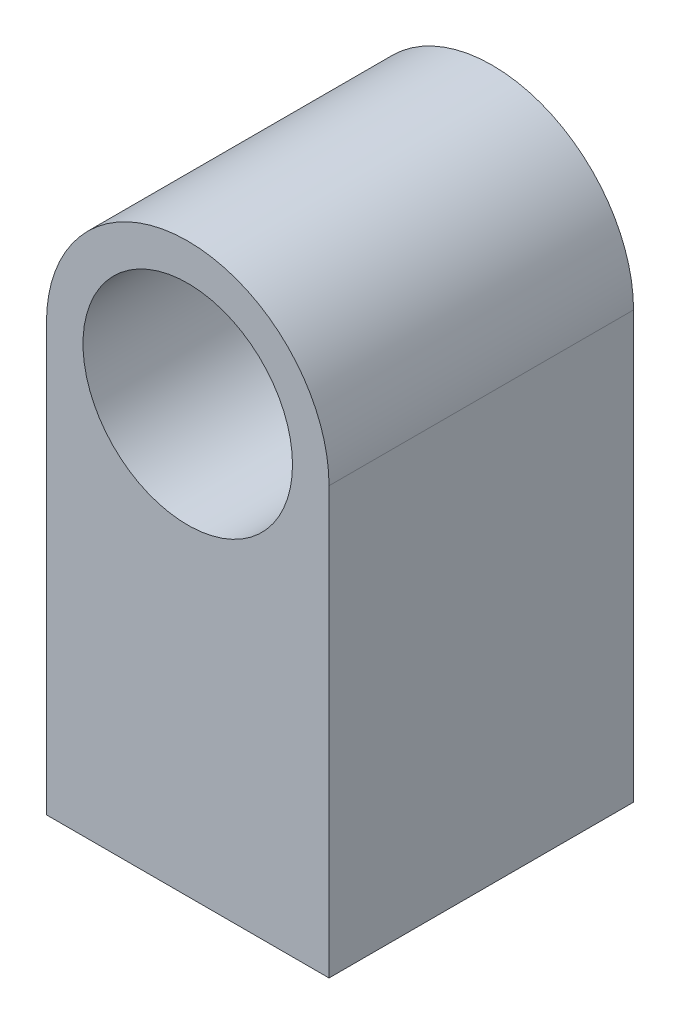
ISO-10303-21;
HEADER;
FILE_DESCRIPTION(('STEP AP214'),'2;1');
FILE_NAME('part.step','',(''),(''),'','','');
FILE_SCHEMA(('AUTOMOTIVE_DESIGN { 1 0 10303 214 1 1 1 1 }'));
ENDSEC;
DATA;
#1=APPLICATION_CONTEXT('core data for automotive mechanical design processes');
#2=APPLICATION_PROTOCOL_DEFINITION('international standard','automotive_design',2000,#1);
#3=PRODUCT_CONTEXT('',#1,'mechanical');
#4=PRODUCT('Part','Part','',(#3));
#5=PRODUCT_RELATED_PRODUCT_CATEGORY('part','',(#4));
#6=PRODUCT_DEFINITION_FORMATION('','',#4);
#7=PRODUCT_DEFINITION_CONTEXT('part definition',#1,'design');
#8=PRODUCT_DEFINITION('design','',#6,#7);
#9=PRODUCT_DEFINITION_SHAPE('','',#8);
#10=(LENGTH_UNIT() NAMED_UNIT(*) SI_UNIT(.MILLI.,.METRE.));
#11=(NAMED_UNIT(*) PLANE_ANGLE_UNIT() SI_UNIT($,.RADIAN.));
#12=(NAMED_UNIT(*) SI_UNIT($,.STERADIAN.) SOLID_ANGLE_UNIT());
#13=UNCERTAINTY_MEASURE_WITH_UNIT(LENGTH_MEASURE(1.E-05),#10,'distance_accuracy_value','');
#14=(GEOMETRIC_REPRESENTATION_CONTEXT(3) GLOBAL_UNCERTAINTY_ASSIGNED_CONTEXT((#13)) GLOBAL_UNIT_ASSIGNED_CONTEXT((#10,
#11,#12)) REPRESENTATION_CONTEXT('',''));
#15=CARTESIAN_POINT('',(0.,0.,0.));
#16=DIRECTION('',(0.,0.,1.));
#17=DIRECTION('',(1.,0.,0.));
#18=AXIS2_PLACEMENT_3D('',#15,#16,#17);
#19=CARTESIAN_POINT('',(11.6,-10.,-12.5));
#20=DIRECTION('',(1.,0.,0.));
#21=DIRECTION('',(0.,1.,0.));
#22=AXIS2_PLACEMENT_3D('',#19,#20,#21);
#23=PLANE('',#22);
#24=DIRECTION('',(0.,1.,0.));
#25=VECTOR('',#24,1.);
#26=CARTESIAN_POINT('',(11.6,-10.,12.5));
#27=LINE('',#26,#25);
#28=CARTESIAN_POINT('',(11.6,-35.,12.5));
#29=VERTEX_POINT('',#28);
#30=CARTESIAN_POINT('',(11.6,0.,12.5));
#31=VERTEX_POINT('',#30);
#32=EDGE_CURVE('E122',#29,#31,#27,.T.);
#33=ORIENTED_EDGE('',*,*,#32,.F.);
#34=DIRECTION('',(0.,0.,1.));
#35=VECTOR('',#34,1.);
#36=CARTESIAN_POINT('',(11.6,-35.,-12.5));
#37=LINE('',#36,#35);
#38=CARTESIAN_POINT('',(11.6,-35.,-12.5));
#39=VERTEX_POINT('',#38);
#40=EDGE_CURVE('E101',#39,#29,#37,.T.);
#41=ORIENTED_EDGE('',*,*,#40,.F.);
#42=DIRECTION('',(0.,1.,0.));
#43=VECTOR('',#42,1.);
#44=CARTESIAN_POINT('',(11.6,-10.,-12.5));
#45=LINE('',#44,#43);
#46=CARTESIAN_POINT('',(11.6,0.,-12.5));
#47=VERTEX_POINT('',#46);
#48=EDGE_CURVE('E96',#39,#47,#45,.T.);
#49=ORIENTED_EDGE('',*,*,#48,.T.);
#50=DIRECTION('',(0.,0.,1.));
#51=VECTOR('',#50,1.);
#52=CARTESIAN_POINT('',(11.6,0.,-12.5));
#53=LINE('',#52,#51);
#54=EDGE_CURVE('E66',#47,#31,#53,.T.);
#55=ORIENTED_EDGE('',*,*,#54,.T.);
#56=EDGE_LOOP('',(#33,#41,#49,#55));
#57=FACE_BOUND('',#56,.T.);
#58=ADVANCED_FACE('F39',(#57),#23,.T.);
#59=CARTESIAN_POINT('',(-11.6,-10.,-12.5));
#60=DIRECTION('',(-1.,0.,0.));
#61=DIRECTION('',(0.,-1.,0.));
#62=AXIS2_PLACEMENT_3D('',#59,#60,#61);
#63=PLANE('',#62);
#64=DIRECTION('',(0.,-1.,0.));
#65=VECTOR('',#64,1.);
#66=CARTESIAN_POINT('',(-11.6,-10.,12.5));
#67=LINE('',#66,#65);
#68=CARTESIAN_POINT('',(-11.6,0.,12.5));
#69=VERTEX_POINT('',#68);
#70=CARTESIAN_POINT('',(-11.6,-35.,12.5));
#71=VERTEX_POINT('',#70);
#72=EDGE_CURVE('E73',#69,#71,#67,.T.);
#73=ORIENTED_EDGE('',*,*,#72,.F.);
#74=DIRECTION('',(0.,0.,1.));
#75=VECTOR('',#74,1.);
#76=CARTESIAN_POINT('',(-11.6,0.,-12.5));
#77=LINE('',#76,#75);
#78=CARTESIAN_POINT('',(-11.6,0.,-12.5));
#79=VERTEX_POINT('',#78);
#80=EDGE_CURVE('E48',#79,#69,#77,.T.);
#81=ORIENTED_EDGE('',*,*,#80,.F.);
#82=DIRECTION('',(0.,-1.,0.));
#83=VECTOR('',#82,1.);
#84=CARTESIAN_POINT('',(-11.6,-10.,-12.5));
#85=LINE('',#84,#83);
#86=CARTESIAN_POINT('',(-11.6,-35.,-12.5));
#87=VERTEX_POINT('',#86);
#88=EDGE_CURVE('E82',#79,#87,#85,.T.);
#89=ORIENTED_EDGE('',*,*,#88,.T.);
#90=DIRECTION('',(0.,0.,-1.));
#91=VECTOR('',#90,1.);
#92=CARTESIAN_POINT('',(-11.6,-35.,-12.5));
#93=LINE('',#92,#91);
#94=EDGE_CURVE('E86',#71,#87,#93,.T.);
#95=ORIENTED_EDGE('',*,*,#94,.F.);
#96=EDGE_LOOP('',(#73,#81,#89,#95));
#97=FACE_BOUND('',#96,.T.);
#98=ADVANCED_FACE('F84',(#97),#63,.T.);
#99=CARTESIAN_POINT('',(0.,0.,-12.5));
#100=DIRECTION('',(0.,0.,1.));
#101=DIRECTION('',(1.,0.,0.));
#102=AXIS2_PLACEMENT_3D('',#99,#100,#101);
#103=CYLINDRICAL_SURFACE('',#102,11.6);
#104=CARTESIAN_POINT('',(0.,0.,12.5));
#105=DIRECTION('',(0.,0.,1.));
#106=DIRECTION('',(1.,0.,0.));
#107=AXIS2_PLACEMENT_3D('',#104,#105,#106);
#108=CIRCLE('',#107,11.6);
#109=EDGE_CURVE('E133',#31,#69,#108,.T.);
#110=ORIENTED_EDGE('',*,*,#109,.F.);
#111=ORIENTED_EDGE('',*,*,#54,.F.);
#112=CARTESIAN_POINT('',(0.,0.,-12.5));
#113=DIRECTION('',(0.,0.,1.));
#114=DIRECTION('',(1.,0.,0.));
#115=AXIS2_PLACEMENT_3D('',#112,#113,#114);
#116=CIRCLE('',#115,11.6);
#117=EDGE_CURVE('E91',#47,#79,#116,.T.);
#118=ORIENTED_EDGE('',*,*,#117,.T.);
#119=ORIENTED_EDGE('',*,*,#80,.T.);
#120=EDGE_LOOP('',(#110,#111,#118,#119));
#121=FACE_BOUND('',#120,.T.);
#122=ADVANCED_FACE('F141',(#121),#103,.T.);
#123=CARTESIAN_POINT('',(0.,0.,-12.5));
#124=DIRECTION('',(0.,0.,1.));
#125=DIRECTION('',(1.,0.,0.));
#126=AXIS2_PLACEMENT_3D('',#123,#124,#125);
#127=PLANE('',#126);
#128=CARTESIAN_POINT('',(0.,0.,-12.5));
#129=DIRECTION('',(0.,0.,1.));
#130=DIRECTION('',(1.,0.,0.));
#131=AXIS2_PLACEMENT_3D('',#128,#129,#130);
#132=CIRCLE('',#131,8.6);
#133=CARTESIAN_POINT('',(8.6,0.,-12.5));
#134=VERTEX_POINT('',#133);
#135=EDGE_CURVE('E118',#134,#134,#132,.T.);
#136=ORIENTED_EDGE('',*,*,#135,.T.);
#137=EDGE_LOOP('',(#136));
#138=FACE_BOUND('',#137,.T.);
#139=ORIENTED_EDGE('',*,*,#48,.F.);
#140=DIRECTION('',(1.,0.,0.));
#141=VECTOR('',#140,1.);
#142=CARTESIAN_POINT('',(-11.6,-35.,-12.5));
#143=LINE('',#142,#141);
#144=EDGE_CURVE('E94',#87,#39,#143,.T.);
#145=ORIENTED_EDGE('',*,*,#144,.F.);
#146=ORIENTED_EDGE('',*,*,#88,.F.);
#147=ORIENTED_EDGE('',*,*,#117,.F.);
#148=EDGE_LOOP('',(#139,#145,#146,#147));
#149=FACE_BOUND('',#148,.T.);
#150=ADVANCED_FACE('F95',(#138,#149),#127,.F.);
#151=CARTESIAN_POINT('',(0.,0.,12.5));
#152=DIRECTION('',(0.,0.,1.));
#153=DIRECTION('',(1.,0.,0.));
#154=AXIS2_PLACEMENT_3D('',#151,#152,#153);
#155=PLANE('',#154);
#156=CARTESIAN_POINT('',(0.,0.,12.5));
#157=DIRECTION('',(0.,0.,1.));
#158=DIRECTION('',(1.,0.,0.));
#159=AXIS2_PLACEMENT_3D('',#156,#157,#158);
#160=CIRCLE('',#159,8.6);
#161=CARTESIAN_POINT('',(8.6,0.,12.5));
#162=VERTEX_POINT('',#161);
#163=EDGE_CURVE('E117',#162,#162,#160,.T.);
#164=ORIENTED_EDGE('',*,*,#163,.F.);
#165=EDGE_LOOP('',(#164));
#166=FACE_BOUND('',#165,.T.);
#167=ORIENTED_EDGE('',*,*,#32,.T.);
#168=ORIENTED_EDGE('',*,*,#109,.T.);
#169=ORIENTED_EDGE('',*,*,#72,.T.);
#170=DIRECTION('',(-1.,0.,0.));
#171=VECTOR('',#170,1.);
#172=CARTESIAN_POINT('',(-11.6,-35.,12.5));
#173=LINE('',#172,#171);
#174=EDGE_CURVE('E105',#29,#71,#173,.T.);
#175=ORIENTED_EDGE('',*,*,#174,.F.);
#176=EDGE_LOOP('',(#167,#168,#169,#175));
#177=FACE_BOUND('',#176,.T.);
#178=ADVANCED_FACE('F142',(#166,#177),#155,.T.);
#179=CARTESIAN_POINT('',(0.,0.,-12.5));
#180=DIRECTION('',(0.,0.,1.));
#181=DIRECTION('',(1.,0.,0.));
#182=AXIS2_PLACEMENT_3D('',#179,#180,#181);
#183=CYLINDRICAL_SURFACE('',#182,8.6);
#184=ORIENTED_EDGE('',*,*,#135,.F.);
#185=EDGE_LOOP('',(#184));
#186=FACE_BOUND('',#185,.T.);
#187=ORIENTED_EDGE('',*,*,#163,.T.);
#188=EDGE_LOOP('',(#187));
#189=FACE_BOUND('',#188,.T.);
#190=ADVANCED_FACE('F159',(#186,#189),#183,.F.);
#191=CARTESIAN_POINT('',(0.,-35.,0.));
#192=DIRECTION('',(0.,1.,0.));
#193=DIRECTION('',(0.,0.,1.));
#194=AXIS2_PLACEMENT_3D('',#191,#192,#193);
#195=PLANE('',#194);
#196=ORIENTED_EDGE('',*,*,#94,.T.);
#197=ORIENTED_EDGE('',*,*,#144,.T.);
#198=ORIENTED_EDGE('',*,*,#40,.T.);
#199=ORIENTED_EDGE('',*,*,#174,.T.);
#200=EDGE_LOOP('',(#196,#197,#198,#199));
#201=FACE_BOUND('',#200,.T.);
#202=CARTESIAN_POINT('',(0.,-35.,0.));
#203=DIRECTION('',(0.,-1.,0.));
#204=DIRECTION('',(0.,0.,-1.));
#205=AXIS2_PLACEMENT_3D('',#202,#203,#204);
#206=CIRCLE('',#205,8.6);
#207=CARTESIAN_POINT('',(0.,-35.,-8.6));
#208=VERTEX_POINT('',#207);
#209=EDGE_CURVE('E107',#208,#208,#206,.T.);
#210=ORIENTED_EDGE('',*,*,#209,.F.);
#211=EDGE_LOOP('',(#210));
#212=FACE_BOUND('',#211,.T.);
#213=ADVANCED_FACE('F103',(#201,#212),#195,.F.);
#214=CARTESIAN_POINT('',(0.,-35.,0.));
#215=DIRECTION('',(0.,1.,0.));
#216=DIRECTION('',(0.,0.,1.));
#217=AXIS2_PLACEMENT_3D('',#214,#215,#216);
#218=CYLINDRICAL_SURFACE('',#217,8.6);
#219=ORIENTED_EDGE('',*,*,#209,.T.);
#220=EDGE_LOOP('',(#219));
#221=FACE_BOUND('',#220,.T.);
#222=CARTESIAN_POINT('',(0.,-10.,0.));
#223=DIRECTION('',(0.,-1.,0.));
#224=DIRECTION('',(0.,0.,-1.));
#225=AXIS2_PLACEMENT_3D('',#222,#223,#224);
#226=CIRCLE('',#225,8.6);
#227=CARTESIAN_POINT('',(0.,-10.,-8.6));
#228=VERTEX_POINT('',#227);
#229=EDGE_CURVE('E11',#228,#228,#226,.F.);
#230=ORIENTED_EDGE('',*,*,#229,.T.);
#231=EDGE_LOOP('',(#230));
#232=FACE_BOUND('',#231,.T.);
#233=ADVANCED_FACE('F155',(#221,#232),#218,.F.);
#234=CARTESIAN_POINT('',(-11.6,-10.,-12.5));
#235=DIRECTION('',(0.,-1.,0.));
#236=DIRECTION('',(0.,0.,-1.));
#237=AXIS2_PLACEMENT_3D('',#234,#235,#236);
#238=PLANE('',#237);
#239=ORIENTED_EDGE('',*,*,#229,.F.);
#240=EDGE_LOOP('',(#239));
#241=FACE_BOUND('',#240,.T.);
#242=ADVANCED_FACE('F152',(#241),#238,.T.);
#243=CLOSED_SHELL('',(#58,#98,#122,#150,#178,#190,#213,#233,#242));
#244=MANIFOLD_SOLID_BREP('B2',#243);
#245=ADVANCED_BREP_SHAPE_REPRESENTATION('',(#18,#244),#14);
#246=SHAPE_DEFINITION_REPRESENTATION(#9,#245);
ENDSEC;
END-ISO-10303-21;
